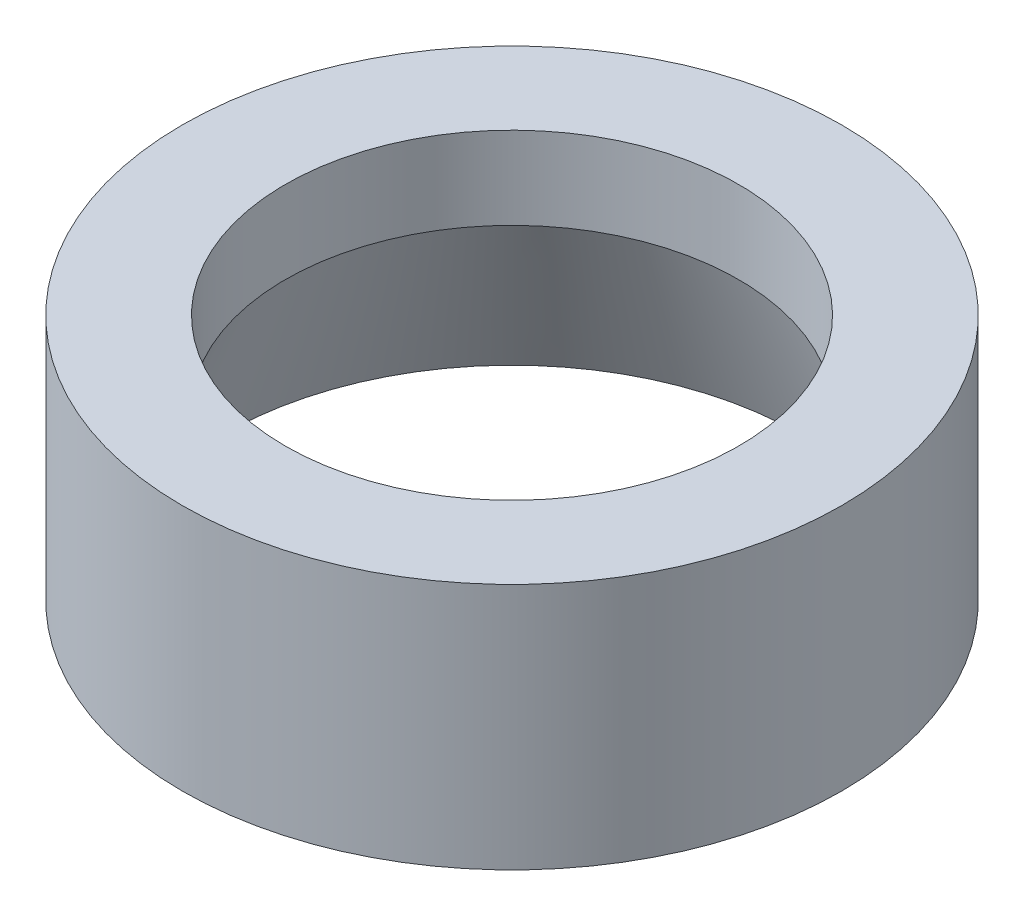
ISO-10303-21;
HEADER;
FILE_DESCRIPTION(('STEP AP214'),'2;1');
FILE_NAME('part.step','',(''),(''),'','','');
FILE_SCHEMA(('AUTOMOTIVE_DESIGN { 1 0 10303 214 1 1 1 1 }'));
ENDSEC;
DATA;
#1=APPLICATION_CONTEXT('core data for automotive mechanical design processes');
#2=APPLICATION_PROTOCOL_DEFINITION('international standard','automotive_design',2000,#1);
#3=PRODUCT_CONTEXT('',#1,'mechanical');
#4=PRODUCT('Part','Part','',(#3));
#5=PRODUCT_RELATED_PRODUCT_CATEGORY('part','',(#4));
#6=PRODUCT_DEFINITION_FORMATION('','',#4);
#7=PRODUCT_DEFINITION_CONTEXT('part definition',#1,'design');
#8=PRODUCT_DEFINITION('design','',#6,#7);
#9=PRODUCT_DEFINITION_SHAPE('','',#8);
#10=(LENGTH_UNIT() NAMED_UNIT(*) SI_UNIT(.MILLI.,.METRE.));
#11=(NAMED_UNIT(*) PLANE_ANGLE_UNIT() SI_UNIT($,.RADIAN.));
#12=(NAMED_UNIT(*) SI_UNIT($,.STERADIAN.) SOLID_ANGLE_UNIT());
#13=UNCERTAINTY_MEASURE_WITH_UNIT(LENGTH_MEASURE(1.E-05),#10,'distance_accuracy_value','');
#14=(GEOMETRIC_REPRESENTATION_CONTEXT(3) GLOBAL_UNCERTAINTY_ASSIGNED_CONTEXT((#13)) GLOBAL_UNIT_ASSIGNED_CONTEXT((#10,
#11,#12)) REPRESENTATION_CONTEXT('',''));
#15=CARTESIAN_POINT('',(0.,0.,0.));
#16=DIRECTION('',(0.,0.,1.));
#17=DIRECTION('',(1.,0.,0.));
#18=AXIS2_PLACEMENT_3D('',#15,#16,#17);
#19=CARTESIAN_POINT('',(2.75,1.5,0.));
#20=DIRECTION('',(0.,-1.,0.));
#21=DIRECTION('',(0.,0.,-1.));
#22=AXIS2_PLACEMENT_3D('',#19,#20,#21);
#23=PLANE('',#22);
#24=CARTESIAN_POINT('',(0.,1.5,0.));
#25=DIRECTION('',(0.,1.,0.));
#26=DIRECTION('',(0.,0.,1.));
#27=AXIS2_PLACEMENT_3D('',#24,#25,#26);
#28=CIRCLE('',#27,2.75);
#29=CARTESIAN_POINT('',(0.,1.5,2.75));
#30=VERTEX_POINT('',#29);
#31=EDGE_CURVE('E51',#30,#30,#28,.T.);
#32=ORIENTED_EDGE('',*,*,#31,.F.);
#33=EDGE_LOOP('',(#32));
#34=FACE_BOUND('',#33,.T.);
#35=CARTESIAN_POINT('',(0.,1.5,0.));
#36=DIRECTION('',(0.,1.,0.));
#37=DIRECTION('',(0.,0.,1.));
#38=AXIS2_PLACEMENT_3D('',#35,#36,#37);
#39=CIRCLE('',#38,4.);
#40=CARTESIAN_POINT('',(0.,1.5,4.));
#41=VERTEX_POINT('',#40);
#42=EDGE_CURVE('E10',#41,#41,#39,.T.);
#43=ORIENTED_EDGE('',*,*,#42,.T.);
#44=EDGE_LOOP('',(#43));
#45=FACE_BOUND('',#44,.T.);
#46=ADVANCED_FACE('F32',(#34,#45),#23,.F.);
#47=CARTESIAN_POINT('',(0.,1.5,0.));
#48=DIRECTION('',(0.,1.,0.));
#49=DIRECTION('',(0.,0.,1.));
#50=AXIS2_PLACEMENT_3D('',#47,#48,#49);
#51=CYLINDRICAL_SURFACE('',#50,4.);
#52=ORIENTED_EDGE('',*,*,#42,.F.);
#53=EDGE_LOOP('',(#52));
#54=FACE_BOUND('',#53,.T.);
#55=CARTESIAN_POINT('',(0.,-1.5,0.));
#56=DIRECTION('',(0.,1.,0.));
#57=DIRECTION('',(0.,0.,1.));
#58=AXIS2_PLACEMENT_3D('',#55,#56,#57);
#59=CIRCLE('',#58,4.);
#60=CARTESIAN_POINT('',(0.,-1.5,4.));
#61=VERTEX_POINT('',#60);
#62=EDGE_CURVE('E38',#61,#61,#59,.T.);
#63=ORIENTED_EDGE('',*,*,#62,.T.);
#64=EDGE_LOOP('',(#63));
#65=FACE_BOUND('',#64,.T.);
#66=ADVANCED_FACE('F58',(#54,#65),#51,.T.);
#67=CARTESIAN_POINT('',(4.,-1.5,0.));
#68=DIRECTION('',(0.,1.,0.));
#69=DIRECTION('',(0.,0.,1.));
#70=AXIS2_PLACEMENT_3D('',#67,#68,#69);
#71=PLANE('',#70);
#72=ORIENTED_EDGE('',*,*,#62,.F.);
#73=EDGE_LOOP('',(#72));
#74=FACE_BOUND('',#73,.T.);
#75=CARTESIAN_POINT('',(0.,-1.5,0.));
#76=DIRECTION('',(0.,1.,0.));
#77=DIRECTION('',(0.,0.,1.));
#78=AXIS2_PLACEMENT_3D('',#75,#76,#77);
#79=CIRCLE('',#78,3.5);
#80=CARTESIAN_POINT('',(0.,-1.5,3.5));
#81=VERTEX_POINT('',#80);
#82=EDGE_CURVE('E42',#81,#81,#79,.T.);
#83=ORIENTED_EDGE('',*,*,#82,.T.);
#84=EDGE_LOOP('',(#83));
#85=FACE_BOUND('',#84,.T.);
#86=ADVANCED_FACE('F62',(#74,#85),#71,.F.);
#87=CARTESIAN_POINT('',(0.,0.5,0.));
#88=DIRECTION('',(0.,-1.,0.));
#89=DIRECTION('',(0.,0.,-1.));
#90=AXIS2_PLACEMENT_3D('',#87,#88,#89);
#91=CONICAL_SURFACE('',#90,2.75,0.358770670270572);
#92=ORIENTED_EDGE('',*,*,#82,.F.);
#93=EDGE_LOOP('',(#92));
#94=FACE_BOUND('',#93,.T.);
#95=CARTESIAN_POINT('',(0.,0.5,0.));
#96=DIRECTION('',(0.,1.,0.));
#97=DIRECTION('',(0.,0.,1.));
#98=AXIS2_PLACEMENT_3D('',#95,#96,#97);
#99=CIRCLE('',#98,2.75);
#100=CARTESIAN_POINT('',(0.,0.5,2.75));
#101=VERTEX_POINT('',#100);
#102=EDGE_CURVE('E46',#101,#101,#99,.T.);
#103=ORIENTED_EDGE('',*,*,#102,.T.);
#104=EDGE_LOOP('',(#103));
#105=FACE_BOUND('',#104,.T.);
#106=ADVANCED_FACE('F67',(#94,#105),#91,.F.);
#107=CARTESIAN_POINT('',(0.,1.5,0.));
#108=DIRECTION('',(0.,1.,0.));
#109=DIRECTION('',(0.,0.,1.));
#110=AXIS2_PLACEMENT_3D('',#107,#108,#109);
#111=CYLINDRICAL_SURFACE('',#110,2.75);
#112=ORIENTED_EDGE('',*,*,#102,.F.);
#113=EDGE_LOOP('',(#112));
#114=FACE_BOUND('',#113,.T.);
#115=ORIENTED_EDGE('',*,*,#31,.T.);
#116=EDGE_LOOP('',(#115));
#117=FACE_BOUND('',#116,.T.);
#118=ADVANCED_FACE('F55',(#114,#117),#111,.F.);
#119=CLOSED_SHELL('',(#46,#66,#86,#106,#118));
#120=MANIFOLD_SOLID_BREP('B2',#119);
#121=ADVANCED_BREP_SHAPE_REPRESENTATION('',(#18,#120),#14);
#122=SHAPE_DEFINITION_REPRESENTATION(#9,#121);
ENDSEC;
END-ISO-10303-21;
